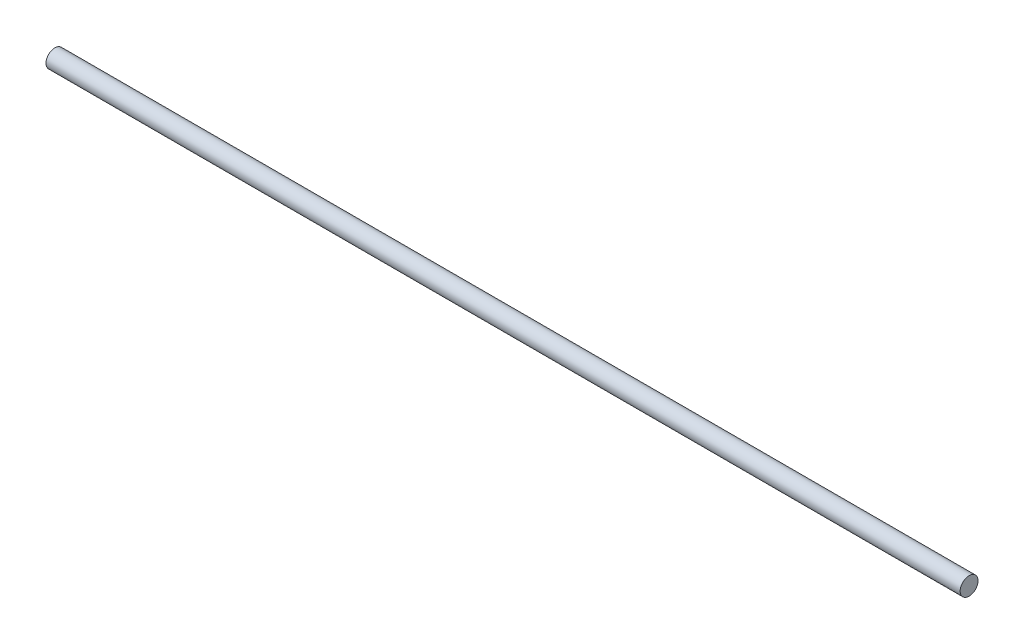
ISO-10303-21;
HEADER;
FILE_DESCRIPTION(('STEP AP214'),'2;1');
FILE_NAME('part.step','',(''),(''),'','','');
FILE_SCHEMA(('AUTOMOTIVE_DESIGN { 1 0 10303 214 1 1 1 1 }'));
ENDSEC;
DATA;
#1=APPLICATION_CONTEXT('core data for automotive mechanical design processes');
#2=APPLICATION_PROTOCOL_DEFINITION('international standard','automotive_design',2000,#1);
#3=PRODUCT_CONTEXT('',#1,'mechanical');
#4=PRODUCT('Part','Part','',(#3));
#5=PRODUCT_RELATED_PRODUCT_CATEGORY('part','',(#4));
#6=PRODUCT_DEFINITION_FORMATION('','',#4);
#7=PRODUCT_DEFINITION_CONTEXT('part definition',#1,'design');
#8=PRODUCT_DEFINITION('design','',#6,#7);
#9=PRODUCT_DEFINITION_SHAPE('','',#8);
#10=(LENGTH_UNIT() NAMED_UNIT(*) SI_UNIT(.MILLI.,.METRE.));
#11=(NAMED_UNIT(*) PLANE_ANGLE_UNIT() SI_UNIT($,.RADIAN.));
#12=(NAMED_UNIT(*) SI_UNIT($,.STERADIAN.) SOLID_ANGLE_UNIT());
#13=UNCERTAINTY_MEASURE_WITH_UNIT(LENGTH_MEASURE(1.E-05),#10,'distance_accuracy_value','');
#14=(GEOMETRIC_REPRESENTATION_CONTEXT(3) GLOBAL_UNCERTAINTY_ASSIGNED_CONTEXT((#13)) GLOBAL_UNIT_ASSIGNED_CONTEXT((#10,
#11,#12)) REPRESENTATION_CONTEXT('',''));
#15=CARTESIAN_POINT('',(0.,0.,0.));
#16=DIRECTION('',(0.,0.,1.));
#17=DIRECTION('',(1.,0.,0.));
#18=AXIS2_PLACEMENT_3D('',#15,#16,#17);
#19=CARTESIAN_POINT('',(410.,0.,0.));
#20=DIRECTION('',(-1.,0.,0.));
#21=DIRECTION('',(0.,0.,1.));
#22=AXIS2_PLACEMENT_3D('',#19,#20,#21);
#23=CYLINDRICAL_SURFACE('',#22,4.);
#24=CARTESIAN_POINT('',(410.,0.,0.));
#25=DIRECTION('',(1.,0.,0.));
#26=DIRECTION('',(0.,0.,-1.));
#27=AXIS2_PLACEMENT_3D('',#24,#25,#26);
#28=CIRCLE('',#27,4.);
#29=CARTESIAN_POINT('',(410.,0.,4.));
#30=VERTEX_POINT('',#29);
#31=EDGE_CURVE('E10',#30,#30,#28,.T.);
#32=CARTESIAN_POINT('',(0.,0.,0.));
#33=DIRECTION('',(1.,0.,0.));
#34=DIRECTION('',(0.,0.,-1.));
#35=AXIS2_PLACEMENT_3D('',#32,#33,#34);
#36=CIRCLE('',#35,4.);
#37=CARTESIAN_POINT('',(0.,0.,4.));
#38=VERTEX_POINT('',#37);
#39=EDGE_CURVE('E33',#38,#38,#36,.T.);
#40=CARTESIAN_POINT('',(410.,0.,4.));
#41=CARTESIAN_POINT('',(405.729166666667,0.,4.));
#42=CARTESIAN_POINT('',(401.458333333333,0.,4.));
#43=CARTESIAN_POINT('',(392.916666666667,0.,4.));
#44=CARTESIAN_POINT('',(388.645833333333,0.,4.));
#45=CARTESIAN_POINT('',(380.104166666667,0.,4.));
#46=CARTESIAN_POINT('',(375.833333333333,0.,4.));
#47=CARTESIAN_POINT('',(367.291666666667,0.,4.));
#48=CARTESIAN_POINT('',(363.020833333333,0.,4.));
#49=CARTESIAN_POINT('',(354.479166666667,0.,4.));
#50=CARTESIAN_POINT('',(350.208333333333,0.,4.));
#51=CARTESIAN_POINT('',(341.666666666667,0.,4.));
#52=CARTESIAN_POINT('',(337.395833333333,0.,4.));
#53=CARTESIAN_POINT('',(328.854166666667,0.,4.));
#54=CARTESIAN_POINT('',(324.583333333333,0.,4.));
#55=CARTESIAN_POINT('',(316.041666666667,0.,4.));
#56=CARTESIAN_POINT('',(311.770833333333,0.,4.));
#57=CARTESIAN_POINT('',(303.229166666667,0.,4.));
#58=CARTESIAN_POINT('',(298.958333333333,0.,4.));
#59=CARTESIAN_POINT('',(290.416666666667,0.,4.));
#60=CARTESIAN_POINT('',(286.145833333333,0.,4.));
#61=CARTESIAN_POINT('',(277.604166666667,0.,4.));
#62=CARTESIAN_POINT('',(273.333333333333,0.,4.));
#63=CARTESIAN_POINT('',(264.791666666667,0.,4.));
#64=CARTESIAN_POINT('',(260.520833333333,0.,4.));
#65=CARTESIAN_POINT('',(251.979166666667,0.,4.));
#66=CARTESIAN_POINT('',(247.708333333333,0.,4.));
#67=CARTESIAN_POINT('',(239.166666666667,0.,4.));
#68=CARTESIAN_POINT('',(234.895833333333,0.,4.));
#69=CARTESIAN_POINT('',(226.354166666667,0.,4.));
#70=CARTESIAN_POINT('',(222.083333333333,0.,4.));
#71=CARTESIAN_POINT('',(213.541666666667,0.,4.));
#72=CARTESIAN_POINT('',(209.270833333333,0.,4.));
#73=CARTESIAN_POINT('',(200.729166666667,0.,4.));
#74=CARTESIAN_POINT('',(196.458333333333,0.,4.));
#75=CARTESIAN_POINT('',(187.916666666667,0.,4.));
#76=CARTESIAN_POINT('',(183.645833333333,0.,4.));
#77=CARTESIAN_POINT('',(175.104166666667,0.,4.));
#78=CARTESIAN_POINT('',(170.833333333333,0.,4.));
#79=CARTESIAN_POINT('',(162.291666666667,0.,4.));
#80=CARTESIAN_POINT('',(158.020833333333,0.,4.));
#81=CARTESIAN_POINT('',(149.479166666667,0.,4.));
#82=CARTESIAN_POINT('',(145.208333333333,0.,4.));
#83=CARTESIAN_POINT('',(136.666666666667,0.,4.));
#84=CARTESIAN_POINT('',(132.395833333333,0.,4.));
#85=CARTESIAN_POINT('',(123.854166666667,0.,4.));
#86=CARTESIAN_POINT('',(119.583333333333,0.,4.));
#87=CARTESIAN_POINT('',(111.041666666667,0.,4.));
#88=CARTESIAN_POINT('',(106.770833333333,0.,4.));
#89=CARTESIAN_POINT('',(98.2291666666667,0.,4.));
#90=CARTESIAN_POINT('',(93.9583333333334,0.,4.));
#91=CARTESIAN_POINT('',(85.4166666666667,0.,4.));
#92=CARTESIAN_POINT('',(81.1458333333334,0.,4.));
#93=CARTESIAN_POINT('',(72.6041666666667,0.,4.));
#94=CARTESIAN_POINT('',(68.3333333333334,0.,4.));
#95=CARTESIAN_POINT('',(59.7916666666667,0.,4.));
#96=CARTESIAN_POINT('',(55.5208333333333,0.,4.));
#97=CARTESIAN_POINT('',(46.9791666666667,0.,4.));
#98=CARTESIAN_POINT('',(42.7083333333333,0.,4.));
#99=CARTESIAN_POINT('',(34.1666666666667,0.,4.));
#100=CARTESIAN_POINT('',(29.8958333333333,0.,4.));
#101=CARTESIAN_POINT('',(21.3541666666667,0.,4.));
#102=CARTESIAN_POINT('',(17.0833333333333,0.,4.));
#103=CARTESIAN_POINT('',(8.54166666666667,0.,4.));
#104=CARTESIAN_POINT('',(4.27083333333333,0.,4.));
#105=CARTESIAN_POINT('',(0.,0.,4.));
#106=B_SPLINE_CURVE_WITH_KNOTS('',3,(#40,#41,#42,#43,#44,#45,#46,#47,#48,#49,#50,#51,#52,#53,
#54,#55,#56,#57,#58,#59,#60,#61,#62,#63,#64,#65,#66,#67,#68,#69,#70,#71,#72,#73,#74,#75,#76,#77,
#78,#79,#80,#81,#82,#83,#84,#85,#86,#87,#88,#89,#90,#91,#92,#93,#94,#95,#96,#97,#98,#99,#100,
#101,#102,#103,#104,#105),.UNSPECIFIED.,.F.,.F.,(4,2,2,2,2,2,2,2,2,2,2,2,2,2,2,2,2,2,2,2,2,2,2,
2,2,2,2,2,2,2,2,2,4),(0.,12.8125,25.625,38.4375,51.25,64.0625,76.875,89.6875,102.5,115.3125,
128.125,140.9375,153.75,166.5625,179.375,192.1875,205.,217.8125,230.625,243.4375,256.25,
269.0625,281.875,294.6875,307.5,320.3125,333.125,345.9375,358.75,371.5625,384.375,397.1875,
410.),.UNSPECIFIED.);
#107=EDGE_CURVE('BSEAM30',#30,#38,#106,.T.);
#108=ORIENTED_EDGE('',*,*,#31,.F.);
#109=ORIENTED_EDGE('',*,*,#39,.T.);
#110=ORIENTED_EDGE('',*,*,#107,.T.);
#111=ORIENTED_EDGE('',*,*,#107,.F.);
#112=EDGE_LOOP('',(#108,#110,#109,#111));
#113=FACE_BOUND('',#112,.T.);
#114=ADVANCED_FACE('F30',(#113),#23,.T.);
#115=CARTESIAN_POINT('',(410.,0.,0.));
#116=DIRECTION('',(1.,0.,0.));
#117=DIRECTION('',(0.,0.,-1.));
#118=AXIS2_PLACEMENT_3D('',#115,#116,#117);
#119=PLANE('',#118);
#120=ORIENTED_EDGE('',*,*,#31,.T.);
#121=EDGE_LOOP('',(#120));
#122=FACE_BOUND('',#121,.T.);
#123=ADVANCED_FACE('F45',(#122),#119,.T.);
#124=CARTESIAN_POINT('',(0.,0.,0.));
#125=DIRECTION('',(1.,0.,0.));
#126=DIRECTION('',(0.,0.,-1.));
#127=AXIS2_PLACEMENT_3D('',#124,#125,#126);
#128=PLANE('',#127);
#129=ORIENTED_EDGE('',*,*,#39,.F.);
#130=EDGE_LOOP('',(#129));
#131=FACE_BOUND('',#130,.T.);
#132=ADVANCED_FACE('F43',(#131),#128,.F.);
#133=CLOSED_SHELL('',(#114,#123,#132));
#134=MANIFOLD_SOLID_BREP('B2',#133);
#135=ADVANCED_BREP_SHAPE_REPRESENTATION('',(#18,#134),#14);
#136=SHAPE_DEFINITION_REPRESENTATION(#9,#135);
ENDSEC;
END-ISO-10303-21;
